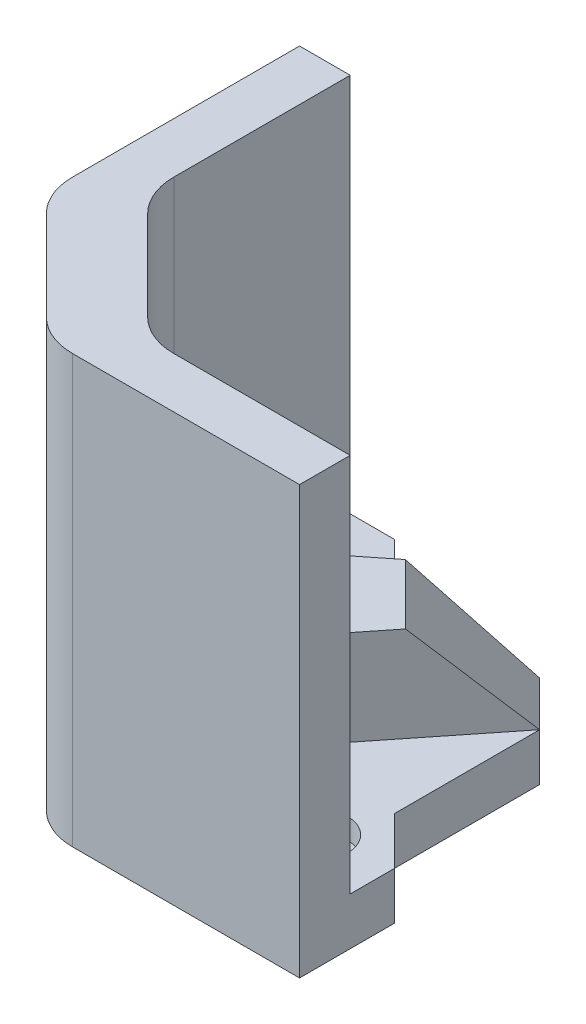
ISO-10303-21;
HEADER;
FILE_DESCRIPTION(('STEP AP214'),'2;1');
FILE_NAME('part.step','',(''),(''),'','','');
FILE_SCHEMA(('AUTOMOTIVE_DESIGN { 1 0 10303 214 1 1 1 1 }'));
ENDSEC;
DATA;
#1=APPLICATION_CONTEXT('core data for automotive mechanical design processes');
#2=APPLICATION_PROTOCOL_DEFINITION('international standard','automotive_design',2000,#1);
#3=PRODUCT_CONTEXT('',#1,'mechanical');
#4=PRODUCT('Part','Part','',(#3));
#5=PRODUCT_RELATED_PRODUCT_CATEGORY('part','',(#4));
#6=PRODUCT_DEFINITION_FORMATION('','',#4);
#7=PRODUCT_DEFINITION_CONTEXT('part definition',#1,'design');
#8=PRODUCT_DEFINITION('design','',#6,#7);
#9=PRODUCT_DEFINITION_SHAPE('','',#8);
#10=(LENGTH_UNIT() NAMED_UNIT(*) SI_UNIT(.MILLI.,.METRE.));
#11=(NAMED_UNIT(*) PLANE_ANGLE_UNIT() SI_UNIT($,.RADIAN.));
#12=(NAMED_UNIT(*) SI_UNIT($,.STERADIAN.) SOLID_ANGLE_UNIT());
#13=UNCERTAINTY_MEASURE_WITH_UNIT(LENGTH_MEASURE(1.E-05),#10,'distance_accuracy_value','');
#14=(GEOMETRIC_REPRESENTATION_CONTEXT(3) GLOBAL_UNCERTAINTY_ASSIGNED_CONTEXT((#13)) GLOBAL_UNIT_ASSIGNED_CONTEXT((#10,
#11,#12)) REPRESENTATION_CONTEXT('',''));
#15=CARTESIAN_POINT('',(0.,0.,0.));
#16=DIRECTION('',(0.,0.,1.));
#17=DIRECTION('',(1.,0.,0.));
#18=AXIS2_PLACEMENT_3D('',#15,#16,#17);
#19=CARTESIAN_POINT('',(0.,7.5,0.));
#20=DIRECTION('',(0.,-1.,0.));
#21=DIRECTION('',(0.,0.,-1.));
#22=AXIS2_PLACEMENT_3D('',#19,#20,#21);
#23=PLANE('',#22);
#24=CARTESIAN_POINT('',(13.4,7.5,-36.5999999999999));
#25=DIRECTION('',(0.,1.,0.));
#26=DIRECTION('',(0.,0.,1.));
#27=AXIS2_PLACEMENT_3D('',#24,#25,#26);
#28=CIRCLE('',#27,5.);
#29=CARTESIAN_POINT('',(13.4,7.5,-31.5999999999999));
#30=VERTEX_POINT('',#29);
#31=EDGE_CURVE('E243',#30,#30,#28,.T.);
#32=ORIENTED_EDGE('',*,*,#31,.F.);
#33=EDGE_LOOP('',(#32));
#34=FACE_BOUND('',#33,.T.);
#35=CARTESIAN_POINT('',(13.4,7.5,-49.1879059907883));
#36=DIRECTION('',(0.,1.,0.));
#37=DIRECTION('',(0.,0.,1.));
#38=AXIS2_PLACEMENT_3D('',#35,#36,#37);
#39=CIRCLE('',#38,5.);
#40=CARTESIAN_POINT('',(13.4,7.5,-44.1879059907883));
#41=VERTEX_POINT('',#40);
#42=EDGE_CURVE('E518',#41,#41,#39,.T.);
#43=ORIENTED_EDGE('',*,*,#42,.F.);
#44=EDGE_LOOP('',(#43));
#45=FACE_BOUND('',#44,.T.);
#46=DIRECTION('',(-0.782758539270881,0.,0.622325533140427));
#47=VECTOR('',#46,1.);
#48=CARTESIAN_POINT('',(45.4289321881342,7.5,-52.5000000000003));
#49=LINE('',#48,#47);
#50=CARTESIAN_POINT('',(45.4289321881342,7.5,-52.5000000000003));
#51=VERTEX_POINT('',#50);
#52=CARTESIAN_POINT('',(10.9289321881345,7.5,-25.0710678118656));
#53=VERTEX_POINT('',#52);
#54=EDGE_CURVE('E210',#51,#53,#49,.T.);
#55=ORIENTED_EDGE('',*,*,#54,.F.);
#56=DIRECTION('',(-1.,0.,0.));
#57=VECTOR('',#56,1.);
#58=CARTESIAN_POINT('',(22.4999999999997,7.5,-52.5000000000003));
#59=LINE('',#58,#57);
#60=CARTESIAN_POINT('',(22.4999999999997,7.5,-52.5000000000003));
#61=VERTEX_POINT('',#60);
#62=EDGE_CURVE('E267',#51,#61,#59,.T.);
#63=ORIENTED_EDGE('',*,*,#62,.T.);
#64=DIRECTION('',(-0.707106781186547,0.,-0.707106781186547));
#65=VECTOR('',#64,1.);
#66=CARTESIAN_POINT('',(15.,7.5,-60.));
#67=LINE('',#66,#65);
#68=CARTESIAN_POINT('',(15.,7.5,-60.));
#69=VERTEX_POINT('',#68);
#70=EDGE_CURVE('E417',#61,#69,#67,.T.);
#71=ORIENTED_EDGE('',*,*,#70,.T.);
#72=DIRECTION('',(-1.,0.,0.));
#73=VECTOR('',#72,1.);
#74=CARTESIAN_POINT('',(0.,7.5,-60.));
#75=LINE('',#74,#73);
#76=CARTESIAN_POINT('',(8.,7.5,-60.));
#77=VERTEX_POINT('',#76);
#78=EDGE_CURVE('E397',#69,#77,#75,.T.);
#79=ORIENTED_EDGE('',*,*,#78,.T.);
#80=DIRECTION('',(0.,0.,-1.));
#81=VECTOR('',#80,1.);
#82=CARTESIAN_POINT('',(8.,7.5,-7.99999999999999));
#83=LINE('',#82,#81);
#84=CARTESIAN_POINT('',(8.,7.5,-32.1421356237311));
#85=VERTEX_POINT('',#84);
#86=EDGE_CURVE('E395',#85,#77,#83,.T.);
#87=ORIENTED_EDGE('',*,*,#86,.F.);
#88=CARTESIAN_POINT('',(18.,7.5,-32.1421356237311));
#89=DIRECTION('',(0.,-1.,0.));
#90=DIRECTION('',(0.,0.,-1.));
#91=AXIS2_PLACEMENT_3D('',#88,#89,#90);
#92=CIRCLE('',#91,10.);
#93=EDGE_CURVE('E211',#85,#53,#92,.F.);
#94=ORIENTED_EDGE('',*,*,#93,.T.);
#95=EDGE_LOOP('',(#55,#63,#71,#79,#87,#94));
#96=FACE_BOUND('',#95,.T.);
#97=ADVANCED_FACE('F39',(#34,#45,#96),#23,.F.);
#98=CARTESIAN_POINT('',(49.1879059907883,7.5,-13.4));
#99=DIRECTION('',(0.,1.,0.));
#100=DIRECTION('',(0.,0.,1.));
#101=AXIS2_PLACEMENT_3D('',#98,#99,#100);
#102=CIRCLE('',#101,5.);
#103=CARTESIAN_POINT('',(49.1879059907883,7.5,-8.4));
#104=VERTEX_POINT('',#103);
#105=EDGE_CURVE('E233',#104,#104,#102,.T.);
#106=ORIENTED_EDGE('',*,*,#105,.F.);
#107=EDGE_LOOP('',(#106));
#108=FACE_BOUND('',#107,.T.);
#109=CARTESIAN_POINT('',(36.5999999999999,7.5,-13.4));
#110=DIRECTION('',(0.,1.,0.));
#111=DIRECTION('',(0.,0.,1.));
#112=AXIS2_PLACEMENT_3D('',#109,#110,#111);
#113=CIRCLE('',#112,5.);
#114=CARTESIAN_POINT('',(36.5999999999999,7.5,-8.4));
#115=VERTEX_POINT('',#114);
#116=EDGE_CURVE('E238',#115,#115,#113,.T.);
#117=ORIENTED_EDGE('',*,*,#116,.F.);
#118=EDGE_LOOP('',(#117));
#119=FACE_BOUND('',#118,.T.);
#120=DIRECTION('',(0.622325533140426,0.,-0.782758539270882));
#121=VECTOR('',#120,1.);
#122=CARTESIAN_POINT('',(52.5000000000002,7.5,-45.4289321881342));
#123=LINE('',#122,#121);
#124=CARTESIAN_POINT('',(25.0710678118654,7.5,-10.9289321881346));
#125=VERTEX_POINT('',#124);
#126=CARTESIAN_POINT('',(52.4999999999997,7.5,-45.4289321881348));
#127=VERTEX_POINT('',#126);
#128=EDGE_CURVE('E186',#125,#127,#123,.T.);
#129=ORIENTED_EDGE('',*,*,#128,.F.);
#130=CARTESIAN_POINT('',(32.1421356237309,7.5,-18.));
#131=DIRECTION('',(0.,-1.,0.));
#132=DIRECTION('',(0.,0.,-1.));
#133=AXIS2_PLACEMENT_3D('',#130,#131,#132);
#134=CIRCLE('',#133,10.);
#135=CARTESIAN_POINT('',(32.1421356237309,7.5,-7.99999999999999));
#136=VERTEX_POINT('',#135);
#137=EDGE_CURVE('E217',#125,#136,#134,.F.);
#138=ORIENTED_EDGE('',*,*,#137,.T.);
#139=DIRECTION('',(-1.,0.,0.));
#140=VECTOR('',#139,1.);
#141=CARTESIAN_POINT('',(60.,7.5,-8.));
#142=LINE('',#141,#140);
#143=CARTESIAN_POINT('',(60.,7.5,-8.));
#144=VERTEX_POINT('',#143);
#145=EDGE_CURVE('E399',#144,#136,#142,.T.);
#146=ORIENTED_EDGE('',*,*,#145,.F.);
#147=DIRECTION('',(0.,0.,-1.));
#148=VECTOR('',#147,1.);
#149=CARTESIAN_POINT('',(60.,7.5,-15.));
#150=LINE('',#149,#148);
#151=CARTESIAN_POINT('',(60.,7.5,-15.));
#152=VERTEX_POINT('',#151);
#153=EDGE_CURVE('E412',#144,#152,#150,.T.);
#154=ORIENTED_EDGE('',*,*,#153,.T.);
#155=DIRECTION('',(-0.707106781186548,0.,-0.707106781186548));
#156=VECTOR('',#155,1.);
#157=CARTESIAN_POINT('',(52.4999999999997,7.5,-22.5000000000003));
#158=LINE('',#157,#156);
#159=CARTESIAN_POINT('',(52.4999999999997,7.5,-22.5000000000003));
#160=VERTEX_POINT('',#159);
#161=EDGE_CURVE('E263',#152,#160,#158,.T.);
#162=ORIENTED_EDGE('',*,*,#161,.T.);
#163=DIRECTION('',(0.,0.,-1.));
#164=VECTOR('',#163,1.);
#165=CARTESIAN_POINT('',(52.4999999999997,7.5,-45.4289321881348));
#166=LINE('',#165,#164);
#167=EDGE_CURVE('E259',#160,#127,#166,.T.);
#168=ORIENTED_EDGE('',*,*,#167,.T.);
#169=EDGE_LOOP('',(#129,#138,#146,#154,#162,#168));
#170=FACE_BOUND('',#169,.T.);
#171=ADVANCED_FACE('F260',(#108,#119,#170),#23,.F.);
#172=CARTESIAN_POINT('',(8.,67.5,-28.0000000000001));
#173=DIRECTION('',(0.707106781186551,0.,-0.707106781186544));
#174=DIRECTION('',(0.,1.,0.));
#175=AXIS2_PLACEMENT_3D('',#172,#173,#174);
#176=PLANE('',#175);
#177=DIRECTION('',(0.707106781186546,0.,0.707106781186549));
#178=VECTOR('',#177,1.);
#179=CARTESIAN_POINT('',(10.9289321881346,22.5,-25.0710678118654));
#180=LINE('',#179,#178);
#181=CARTESIAN_POINT('',(10.9289321881346,22.5,-25.0710678118654));
#182=VERTEX_POINT('',#181);
#183=CARTESIAN_POINT('',(25.0710678118654,22.5,-10.9289321881346));
#184=VERTEX_POINT('',#183);
#185=EDGE_CURVE('E182',#182,#184,#180,.T.);
#186=ORIENTED_EDGE('',*,*,#185,.F.);
#187=DIRECTION('',(0.,-1.,0.));
#188=VECTOR('',#187,1.);
#189=CARTESIAN_POINT('',(10.9289321881345,67.5,-25.0710678118656));
#190=LINE('',#189,#188);
#191=CARTESIAN_POINT('',(10.9289321881345,67.5,-25.0710678118656));
#192=VERTEX_POINT('',#191);
#193=EDGE_CURVE('E191',#182,#192,#190,.F.);
#194=ORIENTED_EDGE('',*,*,#193,.T.);
#195=DIRECTION('',(0.707106781186544,0.,0.707106781186551));
#196=VECTOR('',#195,1.);
#197=CARTESIAN_POINT('',(8.,67.5,-28.0000000000001));
#198=LINE('',#197,#196);
#199=CARTESIAN_POINT('',(25.0710678118654,67.5,-10.9289321881346));
#200=VERTEX_POINT('',#199);
#201=EDGE_CURVE('E456',#200,#192,#198,.F.);
#202=ORIENTED_EDGE('',*,*,#201,.F.);
#203=DIRECTION('',(0.,1.,0.));
#204=VECTOR('',#203,1.);
#205=CARTESIAN_POINT('',(25.0710678118654,7.5,-10.9289321881346));
#206=LINE('',#205,#204);
#207=EDGE_CURVE('E205',#200,#184,#206,.F.);
#208=ORIENTED_EDGE('',*,*,#207,.T.);
#209=EDGE_LOOP('',(#186,#194,#202,#208));
#210=FACE_BOUND('',#209,.T.);
#211=ADVANCED_FACE('F203',(#210),#176,.T.);
#212=CARTESIAN_POINT('',(60.,7.5,0.));
#213=DIRECTION('',(0.,0.,-1.));
#214=DIRECTION('',(-1.,0.,0.));
#215=AXIS2_PLACEMENT_3D('',#212,#213,#214);
#216=PLANE('',#215);
#217=DIRECTION('',(1.,0.,0.));
#218=VECTOR('',#217,1.);
#219=CARTESIAN_POINT('',(0.,67.5,0.));
#220=LINE('',#219,#218);
#221=CARTESIAN_POINT('',(24.142135623731,67.5,0.));
#222=VERTEX_POINT('',#221);
#223=CARTESIAN_POINT('',(60.,67.5,0.));
#224=VERTEX_POINT('',#223);
#225=EDGE_CURVE('E489',#222,#224,#220,.T.);
#226=ORIENTED_EDGE('',*,*,#225,.F.);
#227=DIRECTION('',(0.,1.,0.));
#228=VECTOR('',#227,1.);
#229=CARTESIAN_POINT('',(24.142135623731,0.,0.));
#230=LINE('',#229,#228);
#231=CARTESIAN_POINT('',(24.142135623731,0.,0.));
#232=VERTEX_POINT('',#231);
#233=EDGE_CURVE('E475',#222,#232,#230,.F.);
#234=ORIENTED_EDGE('',*,*,#233,.T.);
#235=DIRECTION('',(1.,0.,0.));
#236=VECTOR('',#235,1.);
#237=CARTESIAN_POINT('',(60.,0.,0.));
#238=LINE('',#237,#236);
#239=CARTESIAN_POINT('',(60.,0.,0.));
#240=VERTEX_POINT('',#239);
#241=EDGE_CURVE('E411',#232,#240,#238,.T.);
#242=ORIENTED_EDGE('',*,*,#241,.T.);
#243=DIRECTION('',(0.,-1.,0.));
#244=VECTOR('',#243,1.);
#245=CARTESIAN_POINT('',(60.,7.5,0.));
#246=LINE('',#245,#244);
#247=EDGE_CURVE('E450',#224,#240,#246,.T.);
#248=ORIENTED_EDGE('',*,*,#247,.F.);
#249=EDGE_LOOP('',(#226,#234,#242,#248));
#250=FACE_BOUND('',#249,.T.);
#251=ADVANCED_FACE('F327',(#250),#216,.F.);
#252=CARTESIAN_POINT('',(60.,7.5,-15.));
#253=DIRECTION('',(-1.,0.,0.));
#254=DIRECTION('',(0.,0.,1.));
#255=AXIS2_PLACEMENT_3D('',#252,#253,#254);
#256=PLANE('',#255);
#257=DIRECTION('',(0.,0.,-1.));
#258=VECTOR('',#257,1.);
#259=CARTESIAN_POINT('',(60.,0.,-15.));
#260=LINE('',#259,#258);
#261=CARTESIAN_POINT('',(60.,0.,-15.));
#262=VERTEX_POINT('',#261);
#263=EDGE_CURVE('E422',#240,#262,#260,.T.);
#264=ORIENTED_EDGE('',*,*,#263,.T.);
#265=DIRECTION('',(0.,-1.,0.));
#266=VECTOR('',#265,1.);
#267=CARTESIAN_POINT('',(60.,7.5,-15.));
#268=LINE('',#267,#266);
#269=EDGE_CURVE('E447',#152,#262,#268,.T.);
#270=ORIENTED_EDGE('',*,*,#269,.F.);
#271=ORIENTED_EDGE('',*,*,#153,.F.);
#272=DIRECTION('',(0.,-1.,0.));
#273=VECTOR('',#272,1.);
#274=CARTESIAN_POINT('',(60.,67.5,-8.));
#275=LINE('',#274,#273);
#276=CARTESIAN_POINT('',(60.,67.5,-8.));
#277=VERTEX_POINT('',#276);
#278=EDGE_CURVE('E408',#277,#144,#275,.T.);
#279=ORIENTED_EDGE('',*,*,#278,.F.);
#280=DIRECTION('',(0.,0.,-1.));
#281=VECTOR('',#280,1.);
#282=CARTESIAN_POINT('',(60.,67.5,0.));
#283=LINE('',#282,#281);
#284=EDGE_CURVE('E486',#224,#277,#283,.T.);
#285=ORIENTED_EDGE('',*,*,#284,.F.);
#286=ORIENTED_EDGE('',*,*,#247,.T.);
#287=EDGE_LOOP('',(#264,#270,#271,#279,#285,#286));
#288=FACE_BOUND('',#287,.T.);
#289=ADVANCED_FACE('F323',(#288),#256,.F.);
#290=CARTESIAN_POINT('',(52.4999999999997,7.5,-22.5000000000003));
#291=DIRECTION('',(-0.707106781186547,0.,0.707106781186547));
#292=DIRECTION('',(0.707106781186548,0.,0.707106781186548));
#293=AXIS2_PLACEMENT_3D('',#290,#291,#292);
#294=PLANE('',#293);
#295=DIRECTION('',(-0.707106781186548,0.,-0.707106781186548));
#296=VECTOR('',#295,1.);
#297=CARTESIAN_POINT('',(52.4999999999997,0.,-22.5000000000003));
#298=LINE('',#297,#296);
#299=CARTESIAN_POINT('',(52.4999999999997,0.,-22.5000000000003));
#300=VERTEX_POINT('',#299);
#301=EDGE_CURVE('E424',#262,#300,#298,.T.);
#302=ORIENTED_EDGE('',*,*,#301,.T.);
#303=DIRECTION('',(0.,-1.,0.));
#304=VECTOR('',#303,1.);
#305=CARTESIAN_POINT('',(52.4999999999997,7.5,-22.5000000000003));
#306=LINE('',#305,#304);
#307=EDGE_CURVE('E272',#160,#300,#306,.T.);
#308=ORIENTED_EDGE('',*,*,#307,.F.);
#309=ORIENTED_EDGE('',*,*,#161,.F.);
#310=ORIENTED_EDGE('',*,*,#269,.T.);
#311=EDGE_LOOP('',(#302,#308,#309,#310));
#312=FACE_BOUND('',#311,.T.);
#313=ADVANCED_FACE('F320',(#312),#294,.F.);
#314=CARTESIAN_POINT('',(52.4999999999997,7.5,-45.4289321881348));
#315=DIRECTION('',(-1.,0.,0.));
#316=DIRECTION('',(0.,0.,1.));
#317=AXIS2_PLACEMENT_3D('',#314,#315,#316);
#318=PLANE('',#317);
#319=DIRECTION('',(0.,0.,-1.));
#320=VECTOR('',#319,1.);
#321=CARTESIAN_POINT('',(52.4999999999997,0.,-45.4289321881348));
#322=LINE('',#321,#320);
#323=CARTESIAN_POINT('',(52.4999999999997,0.,-45.4289321881348));
#324=VERTEX_POINT('',#323);
#325=EDGE_CURVE('E271',#300,#324,#322,.T.);
#326=ORIENTED_EDGE('',*,*,#325,.T.);
#327=DIRECTION('',(0.,-1.,0.));
#328=VECTOR('',#327,1.);
#329=CARTESIAN_POINT('',(52.4999999999997,7.5,-45.4289321881348));
#330=LINE('',#329,#328);
#331=EDGE_CURVE('E252',#127,#324,#330,.T.);
#332=ORIENTED_EDGE('',*,*,#331,.F.);
#333=ORIENTED_EDGE('',*,*,#167,.F.);
#334=ORIENTED_EDGE('',*,*,#307,.T.);
#335=EDGE_LOOP('',(#326,#332,#333,#334));
#336=FACE_BOUND('',#335,.T.);
#337=ADVANCED_FACE('F269',(#336),#318,.F.);
#338=CARTESIAN_POINT('',(45.4289321881342,7.5,-52.5000000000003));
#339=DIRECTION('',(-0.707106781186543,0.,0.707106781186552));
#340=DIRECTION('',(0.707106781186552,0.,0.707106781186543));
#341=AXIS2_PLACEMENT_3D('',#338,#339,#340);
#342=PLANE('',#341);
#343=DIRECTION('',(0.,-1.,0.));
#344=VECTOR('',#343,1.);
#345=CARTESIAN_POINT('',(45.4289321881342,7.5,-52.5000000000003));
#346=LINE('',#345,#344);
#347=CARTESIAN_POINT('',(45.4289321881342,0.,-52.5000000000003));
#348=VERTEX_POINT('',#347);
#349=EDGE_CURVE('E255',#51,#348,#346,.T.);
#350=ORIENTED_EDGE('',*,*,#349,.F.);
#351=DIRECTION('',(0.707106781186552,0.,0.707106781186543));
#352=VECTOR('',#351,1.);
#353=CARTESIAN_POINT('',(45.4289321881342,7.49999999999995,-52.5000000000003));
#354=LINE('',#353,#352);
#355=EDGE_CURVE('E48',#51,#127,#354,.T.);
#356=ORIENTED_EDGE('',*,*,#355,.T.);
#357=ORIENTED_EDGE('',*,*,#331,.T.);
#358=DIRECTION('',(-0.707106781186552,0.,-0.707106781186543));
#359=VECTOR('',#358,1.);
#360=CARTESIAN_POINT('',(45.4289321881342,0.,-52.5000000000003));
#361=LINE('',#360,#359);
#362=EDGE_CURVE('E427',#324,#348,#361,.T.);
#363=ORIENTED_EDGE('',*,*,#362,.T.);
#364=EDGE_LOOP('',(#350,#356,#357,#363));
#365=FACE_BOUND('',#364,.T.);
#366=ADVANCED_FACE('F250',(#365),#342,.F.);
#367=CARTESIAN_POINT('',(22.4999999999997,7.5,-52.5000000000003));
#368=DIRECTION('',(0.,0.,1.));
#369=DIRECTION('',(1.,0.,0.));
#370=AXIS2_PLACEMENT_3D('',#367,#368,#369);
#371=PLANE('',#370);
#372=DIRECTION('',(-1.,0.,0.));
#373=VECTOR('',#372,1.);
#374=CARTESIAN_POINT('',(22.4999999999997,0.,-52.5000000000003));
#375=LINE('',#374,#373);
#376=CARTESIAN_POINT('',(22.4999999999997,0.,-52.5000000000003));
#377=VERTEX_POINT('',#376);
#378=EDGE_CURVE('E429',#348,#377,#375,.T.);
#379=ORIENTED_EDGE('',*,*,#378,.T.);
#380=DIRECTION('',(0.,-1.,0.));
#381=VECTOR('',#380,1.);
#382=CARTESIAN_POINT('',(22.4999999999997,7.5,-52.5000000000003));
#383=LINE('',#382,#381);
#384=EDGE_CURVE('E442',#61,#377,#383,.T.);
#385=ORIENTED_EDGE('',*,*,#384,.F.);
#386=ORIENTED_EDGE('',*,*,#62,.F.);
#387=ORIENTED_EDGE('',*,*,#349,.T.);
#388=EDGE_LOOP('',(#379,#385,#386,#387));
#389=FACE_BOUND('',#388,.T.);
#390=ADVANCED_FACE('F311',(#389),#371,.F.);
#391=CARTESIAN_POINT('',(15.,7.5,-60.));
#392=DIRECTION('',(-0.707106781186547,0.,0.707106781186547));
#393=DIRECTION('',(0.707106781186548,0.,0.707106781186548));
#394=AXIS2_PLACEMENT_3D('',#391,#392,#393);
#395=PLANE('',#394);
#396=DIRECTION('',(-0.707106781186547,0.,-0.707106781186547));
#397=VECTOR('',#396,1.);
#398=CARTESIAN_POINT('',(15.,0.,-60.));
#399=LINE('',#398,#397);
#400=CARTESIAN_POINT('',(15.,0.,-60.));
#401=VERTEX_POINT('',#400);
#402=EDGE_CURVE('E431',#377,#401,#399,.T.);
#403=ORIENTED_EDGE('',*,*,#402,.T.);
#404=DIRECTION('',(0.,-1.,0.));
#405=VECTOR('',#404,1.);
#406=CARTESIAN_POINT('',(15.,7.5,-60.));
#407=LINE('',#406,#405);
#408=EDGE_CURVE('E439',#69,#401,#407,.T.);
#409=ORIENTED_EDGE('',*,*,#408,.F.);
#410=ORIENTED_EDGE('',*,*,#70,.F.);
#411=ORIENTED_EDGE('',*,*,#384,.T.);
#412=EDGE_LOOP('',(#403,#409,#410,#411));
#413=FACE_BOUND('',#412,.T.);
#414=ADVANCED_FACE('F307',(#413),#395,.F.);
#415=CARTESIAN_POINT('',(0.,7.5,-60.));
#416=DIRECTION('',(0.,0.,1.));
#417=DIRECTION('',(1.,0.,0.));
#418=AXIS2_PLACEMENT_3D('',#415,#416,#417);
#419=PLANE('',#418);
#420=DIRECTION('',(-1.,0.,0.));
#421=VECTOR('',#420,1.);
#422=CARTESIAN_POINT('',(0.,0.,-60.));
#423=LINE('',#422,#421);
#424=CARTESIAN_POINT('',(0.,0.,-60.));
#425=VERTEX_POINT('',#424);
#426=EDGE_CURVE('E433',#401,#425,#423,.T.);
#427=ORIENTED_EDGE('',*,*,#426,.T.);
#428=DIRECTION('',(0.,-1.,0.));
#429=VECTOR('',#428,1.);
#430=CARTESIAN_POINT('',(0.,7.5,-60.));
#431=LINE('',#430,#429);
#432=CARTESIAN_POINT('',(0.,67.5,-60.));
#433=VERTEX_POINT('',#432);
#434=EDGE_CURVE('E420',#433,#425,#431,.T.);
#435=ORIENTED_EDGE('',*,*,#434,.F.);
#436=DIRECTION('',(-1.,0.,0.));
#437=VECTOR('',#436,1.);
#438=CARTESIAN_POINT('',(8.,67.5,-60.));
#439=LINE('',#438,#437);
#440=CARTESIAN_POINT('',(8.,67.5,-60.));
#441=VERTEX_POINT('',#440);
#442=EDGE_CURVE('E398',#441,#433,#439,.T.);
#443=ORIENTED_EDGE('',*,*,#442,.F.);
#444=DIRECTION('',(0.,-1.,0.));
#445=VECTOR('',#444,1.);
#446=CARTESIAN_POINT('',(8.,67.5,-60.));
#447=LINE('',#446,#445);
#448=EDGE_CURVE('E388',#441,#77,#447,.T.);
#449=ORIENTED_EDGE('',*,*,#448,.T.);
#450=ORIENTED_EDGE('',*,*,#78,.F.);
#451=ORIENTED_EDGE('',*,*,#408,.T.);
#452=EDGE_LOOP('',(#427,#435,#443,#449,#450,#451));
#453=FACE_BOUND('',#452,.T.);
#454=ADVANCED_FACE('F303',(#453),#419,.F.);
#455=CARTESIAN_POINT('',(0.,7.5,0.));
#456=DIRECTION('',(1.,0.,0.));
#457=DIRECTION('',(0.,0.,-1.));
#458=AXIS2_PLACEMENT_3D('',#455,#456,#457);
#459=PLANE('',#458);
#460=DIRECTION('',(0.,0.,1.));
#461=VECTOR('',#460,1.);
#462=CARTESIAN_POINT('',(0.,0.,0.));
#463=LINE('',#462,#461);
#464=CARTESIAN_POINT('',(0.,0.,-24.142135623731));
#465=VERTEX_POINT('',#464);
#466=EDGE_CURVE('E414',#425,#465,#463,.T.);
#467=ORIENTED_EDGE('',*,*,#466,.T.);
#468=DIRECTION('',(0.,-1.,0.));
#469=VECTOR('',#468,1.);
#470=CARTESIAN_POINT('',(0.,67.5,-24.142135623731));
#471=LINE('',#470,#469);
#472=CARTESIAN_POINT('',(0.,67.5,-24.142135623731));
#473=VERTEX_POINT('',#472);
#474=EDGE_CURVE('E461',#465,#473,#471,.F.);
#475=ORIENTED_EDGE('',*,*,#474,.T.);
#476=DIRECTION('',(0.,0.,1.));
#477=VECTOR('',#476,1.);
#478=CARTESIAN_POINT('',(0.,67.5,-60.));
#479=LINE('',#478,#477);
#480=EDGE_CURVE('E401',#433,#473,#479,.T.);
#481=ORIENTED_EDGE('',*,*,#480,.F.);
#482=ORIENTED_EDGE('',*,*,#434,.T.);
#483=EDGE_LOOP('',(#467,#475,#481,#482));
#484=FACE_BOUND('',#483,.T.);
#485=ADVANCED_FACE('F299',(#484),#459,.F.);
#486=CARTESIAN_POINT('',(0.,0.,0.));
#487=DIRECTION('',(0.,-1.,0.));
#488=DIRECTION('',(0.,0.,-1.));
#489=AXIS2_PLACEMENT_3D('',#486,#487,#488);
#490=PLANE('',#489);
#491=CARTESIAN_POINT('',(49.1879059907883,0.,-13.4));
#492=DIRECTION('',(0.,1.,0.));
#493=DIRECTION('',(0.,0.,1.));
#494=AXIS2_PLACEMENT_3D('',#491,#492,#493);
#495=CIRCLE('',#494,2.7);
#496=CARTESIAN_POINT('',(49.1879059907883,0.,-10.7));
#497=VERTEX_POINT('',#496);
#498=EDGE_CURVE('E496',#497,#497,#495,.T.);
#499=ORIENTED_EDGE('',*,*,#498,.T.);
#500=EDGE_LOOP('',(#499));
#501=FACE_BOUND('',#500,.T.);
#502=CARTESIAN_POINT('',(13.4,0.,-49.1879059907883));
#503=DIRECTION('',(0.,1.,0.));
#504=DIRECTION('',(0.,0.,-1.));
#505=AXIS2_PLACEMENT_3D('',#502,#503,#504);
#506=CIRCLE('',#505,2.69999999999999);
#507=CARTESIAN_POINT('',(13.4,0.,-51.8879059907883));
#508=VERTEX_POINT('',#507);
#509=EDGE_CURVE('E497',#508,#508,#506,.T.);
#510=ORIENTED_EDGE('',*,*,#509,.T.);
#511=EDGE_LOOP('',(#510));
#512=FACE_BOUND('',#511,.T.);
#513=CARTESIAN_POINT('',(13.4,0.,-36.5999999999999));
#514=DIRECTION('',(0.,1.,0.));
#515=DIRECTION('',(0.,0.,-1.));
#516=AXIS2_PLACEMENT_3D('',#513,#514,#515);
#517=CIRCLE('',#516,2.7);
#518=CARTESIAN_POINT('',(13.4,0.,-39.2999999999999));
#519=VERTEX_POINT('',#518);
#520=EDGE_CURVE('E228',#519,#519,#517,.T.);
#521=ORIENTED_EDGE('',*,*,#520,.T.);
#522=EDGE_LOOP('',(#521));
#523=FACE_BOUND('',#522,.T.);
#524=CARTESIAN_POINT('',(36.5999999999999,0.,-13.4));
#525=DIRECTION('',(0.,1.,0.));
#526=DIRECTION('',(0.,0.,1.));
#527=AXIS2_PLACEMENT_3D('',#524,#525,#526);
#528=CIRCLE('',#527,2.69999999999998);
#529=CARTESIAN_POINT('',(36.5999999999999,0.,-10.7));
#530=VERTEX_POINT('',#529);
#531=EDGE_CURVE('E404',#530,#530,#528,.T.);
#532=ORIENTED_EDGE('',*,*,#531,.T.);
#533=EDGE_LOOP('',(#532));
#534=FACE_BOUND('',#533,.T.);
#535=DIRECTION('',(0.707106781186546,0.,0.707106781186549));
#536=VECTOR('',#535,1.);
#537=CARTESIAN_POINT('',(10.,0.,-10.));
#538=LINE('',#537,#536);
#539=CARTESIAN_POINT('',(17.0710678118655,0.,-2.92893218813454));
#540=VERTEX_POINT('',#539);
#541=CARTESIAN_POINT('',(2.92893218813452,0.,-17.0710678118656));
#542=VERTEX_POINT('',#541);
#543=EDGE_CURVE('E453',#540,#542,#538,.F.);
#544=ORIENTED_EDGE('',*,*,#543,.T.);
#545=CARTESIAN_POINT('',(10.,0.,-24.142135623731));
#546=DIRECTION('',(0.,-1.,0.));
#547=DIRECTION('',(0.,0.,-1.));
#548=AXIS2_PLACEMENT_3D('',#545,#546,#547);
#549=CIRCLE('',#548,10.);
#550=EDGE_CURVE('E474',#542,#465,#549,.T.);
#551=ORIENTED_EDGE('',*,*,#550,.T.);
#552=ORIENTED_EDGE('',*,*,#466,.F.);
#553=ORIENTED_EDGE('',*,*,#426,.F.);
#554=ORIENTED_EDGE('',*,*,#402,.F.);
#555=ORIENTED_EDGE('',*,*,#378,.F.);
#556=ORIENTED_EDGE('',*,*,#362,.F.);
#557=ORIENTED_EDGE('',*,*,#325,.F.);
#558=ORIENTED_EDGE('',*,*,#301,.F.);
#559=ORIENTED_EDGE('',*,*,#263,.F.);
#560=ORIENTED_EDGE('',*,*,#241,.F.);
#561=CARTESIAN_POINT('',(24.142135623731,0.,-10.));
#562=DIRECTION('',(0.,-1.,0.));
#563=DIRECTION('',(0.,0.,-1.));
#564=AXIS2_PLACEMENT_3D('',#561,#562,#563);
#565=CIRCLE('',#564,10.);
#566=EDGE_CURVE('E472',#232,#540,#565,.T.);
#567=ORIENTED_EDGE('',*,*,#566,.T.);
#568=EDGE_LOOP('',(#544,#551,#552,#553,#554,#555,#556,#557,#558,#559,#560,#567));
#569=FACE_BOUND('',#568,.T.);
#570=ADVANCED_FACE('F296',(#501,#512,#523,#534,#569),#490,.T.);
#571=CARTESIAN_POINT('',(60.,67.5,-8.));
#572=DIRECTION('',(0.,0.,1.));
#573=DIRECTION('',(1.,0.,0.));
#574=AXIS2_PLACEMENT_3D('',#571,#572,#573);
#575=PLANE('',#574);
#576=ORIENTED_EDGE('',*,*,#145,.T.);
#577=DIRECTION('',(0.,-1.,0.));
#578=VECTOR('',#577,1.);
#579=CARTESIAN_POINT('',(32.1421356237309,67.5,-7.99999999999999));
#580=LINE('',#579,#578);
#581=CARTESIAN_POINT('',(32.1421356237309,67.5,-7.99999999999999));
#582=VERTEX_POINT('',#581);
#583=EDGE_CURVE('E200',#136,#582,#580,.F.);
#584=ORIENTED_EDGE('',*,*,#583,.T.);
#585=DIRECTION('',(-1.,0.,0.));
#586=VECTOR('',#585,1.);
#587=CARTESIAN_POINT('',(60.,67.5,-8.));
#588=LINE('',#587,#586);
#589=EDGE_CURVE('E391',#277,#582,#588,.T.);
#590=ORIENTED_EDGE('',*,*,#589,.F.);
#591=ORIENTED_EDGE('',*,*,#278,.T.);
#592=EDGE_LOOP('',(#576,#584,#590,#591));
#593=FACE_BOUND('',#592,.T.);
#594=ADVANCED_FACE('F294',(#593),#575,.F.);
#595=CARTESIAN_POINT('',(8.,67.5,-7.99999999999999));
#596=DIRECTION('',(-1.,0.,0.));
#597=DIRECTION('',(0.,0.,1.));
#598=AXIS2_PLACEMENT_3D('',#595,#596,#597);
#599=PLANE('',#598);
#600=DIRECTION('',(0.,0.,-1.));
#601=VECTOR('',#600,1.);
#602=CARTESIAN_POINT('',(8.,67.5,-7.99999999999999));
#603=LINE('',#602,#601);
#604=CARTESIAN_POINT('',(8.,67.5,-32.1421356237311));
#605=VERTEX_POINT('',#604);
#606=EDGE_CURVE('E385',#605,#441,#603,.T.);
#607=ORIENTED_EDGE('',*,*,#606,.F.);
#608=DIRECTION('',(0.,1.,0.));
#609=VECTOR('',#608,1.);
#610=CARTESIAN_POINT('',(8.,7.5,-32.1421356237311));
#611=LINE('',#610,#609);
#612=EDGE_CURVE('E219',#605,#85,#611,.F.);
#613=ORIENTED_EDGE('',*,*,#612,.T.);
#614=ORIENTED_EDGE('',*,*,#86,.T.);
#615=ORIENTED_EDGE('',*,*,#448,.F.);
#616=EDGE_LOOP('',(#607,#613,#614,#615));
#617=FACE_BOUND('',#616,.T.);
#618=ADVANCED_FACE('F375',(#617),#599,.F.);
#619=CARTESIAN_POINT('',(0.,67.5,0.));
#620=DIRECTION('',(0.,1.,0.));
#621=DIRECTION('',(0.,0.,1.));
#622=AXIS2_PLACEMENT_3D('',#619,#620,#621);
#623=PLANE('',#622);
#624=ORIENTED_EDGE('',*,*,#480,.T.);
#625=CARTESIAN_POINT('',(10.,67.5,-24.142135623731));
#626=DIRECTION('',(0.,1.,0.));
#627=DIRECTION('',(0.,0.,1.));
#628=AXIS2_PLACEMENT_3D('',#625,#626,#627);
#629=CIRCLE('',#628,10.);
#630=CARTESIAN_POINT('',(2.92893218813452,67.5,-17.0710678118656));
#631=VERTEX_POINT('',#630);
#632=EDGE_CURVE('E466',#473,#631,#629,.T.);
#633=ORIENTED_EDGE('',*,*,#632,.T.);
#634=DIRECTION('',(-0.707106781186546,0.,-0.707106781186549));
#635=VECTOR('',#634,1.);
#636=CARTESIAN_POINT('',(10.,67.5,-10.));
#637=LINE('',#636,#635);
#638=CARTESIAN_POINT('',(17.0710678118655,67.5,-2.92893218813454));
#639=VERTEX_POINT('',#638);
#640=EDGE_CURVE('E458',#631,#639,#637,.F.);
#641=ORIENTED_EDGE('',*,*,#640,.T.);
#642=CARTESIAN_POINT('',(24.142135623731,67.5,-10.));
#643=DIRECTION('',(0.,1.,0.));
#644=DIRECTION('',(0.,0.,1.));
#645=AXIS2_PLACEMENT_3D('',#642,#643,#644);
#646=CIRCLE('',#645,10.);
#647=EDGE_CURVE('E464',#639,#222,#646,.T.);
#648=ORIENTED_EDGE('',*,*,#647,.T.);
#649=ORIENTED_EDGE('',*,*,#225,.T.);
#650=ORIENTED_EDGE('',*,*,#284,.T.);
#651=ORIENTED_EDGE('',*,*,#589,.T.);
#652=CARTESIAN_POINT('',(32.1421356237309,67.5,-18.));
#653=DIRECTION('',(0.,1.,0.));
#654=DIRECTION('',(0.,0.,1.));
#655=AXIS2_PLACEMENT_3D('',#652,#653,#654);
#656=CIRCLE('',#655,10.);
#657=EDGE_CURVE('E222',#582,#200,#656,.F.);
#658=ORIENTED_EDGE('',*,*,#657,.T.);
#659=ORIENTED_EDGE('',*,*,#201,.T.);
#660=CARTESIAN_POINT('',(18.,67.5,-32.1421356237311));
#661=DIRECTION('',(0.,1.,0.));
#662=DIRECTION('',(0.,0.,1.));
#663=AXIS2_PLACEMENT_3D('',#660,#661,#662);
#664=CIRCLE('',#663,10.);
#665=EDGE_CURVE('E196',#192,#605,#664,.F.);
#666=ORIENTED_EDGE('',*,*,#665,.T.);
#667=ORIENTED_EDGE('',*,*,#606,.T.);
#668=ORIENTED_EDGE('',*,*,#442,.T.);
#669=EDGE_LOOP('',(#624,#633,#641,#648,#649,#650,#651,#658,#659,#666,#667,#668));
#670=FACE_BOUND('',#669,.T.);
#671=ADVANCED_FACE('F340',(#670),#623,.T.);
#672=CARTESIAN_POINT('',(20.,7.5,0.));
#673=DIRECTION('',(0.707106781186549,0.,-0.707106781186546));
#674=DIRECTION('',(0.,-1.,0.));
#675=AXIS2_PLACEMENT_3D('',#672,#673,#674);
#676=PLANE('',#675);
#677=ORIENTED_EDGE('',*,*,#640,.F.);
#678=DIRECTION('',(0.,1.,0.));
#679=VECTOR('',#678,1.);
#680=CARTESIAN_POINT('',(2.92893218813452,0.,-17.0710678118656));
#681=LINE('',#680,#679);
#682=EDGE_CURVE('E470',#631,#542,#681,.F.);
#683=ORIENTED_EDGE('',*,*,#682,.T.);
#684=ORIENTED_EDGE('',*,*,#543,.F.);
#685=DIRECTION('',(0.,-1.,0.));
#686=VECTOR('',#685,1.);
#687=CARTESIAN_POINT('',(17.0710678118655,67.5,-2.92893218813454));
#688=LINE('',#687,#686);
#689=EDGE_CURVE('E468',#540,#639,#688,.F.);
#690=ORIENTED_EDGE('',*,*,#689,.T.);
#691=EDGE_LOOP('',(#677,#683,#684,#690));
#692=FACE_BOUND('',#691,.T.);
#693=ADVANCED_FACE('F333',(#692),#676,.F.);
#694=CARTESIAN_POINT('',(10.,7.5,-24.142135623731));
#695=DIRECTION('',(0.,1.,0.));
#696=DIRECTION('',(0.,0.,1.));
#697=AXIS2_PLACEMENT_3D('',#694,#695,#696);
#698=CYLINDRICAL_SURFACE('',#697,10.);
#699=ORIENTED_EDGE('',*,*,#550,.F.);
#700=ORIENTED_EDGE('',*,*,#682,.F.);
#701=ORIENTED_EDGE('',*,*,#632,.F.);
#702=ORIENTED_EDGE('',*,*,#474,.F.);
#703=EDGE_LOOP('',(#699,#700,#701,#702));
#704=FACE_BOUND('',#703,.T.);
#705=ADVANCED_FACE('F339',(#704),#698,.T.);
#706=CARTESIAN_POINT('',(24.142135623731,7.5,-10.));
#707=DIRECTION('',(0.,-1.,0.));
#708=DIRECTION('',(0.,0.,-1.));
#709=AXIS2_PLACEMENT_3D('',#706,#707,#708);
#710=CYLINDRICAL_SURFACE('',#709,10.);
#711=ORIENTED_EDGE('',*,*,#647,.F.);
#712=ORIENTED_EDGE('',*,*,#689,.F.);
#713=ORIENTED_EDGE('',*,*,#566,.F.);
#714=ORIENTED_EDGE('',*,*,#233,.F.);
#715=EDGE_LOOP('',(#711,#712,#713,#714));
#716=FACE_BOUND('',#715,.T.);
#717=ADVANCED_FACE('F348',(#716),#710,.T.);
#718=CARTESIAN_POINT('',(32.1421356237309,67.5,-18.));
#719=DIRECTION('',(0.,1.,0.));
#720=DIRECTION('',(0.,0.,1.));
#721=AXIS2_PLACEMENT_3D('',#718,#719,#720);
#722=CYLINDRICAL_SURFACE('',#721,10.);
#723=ORIENTED_EDGE('',*,*,#137,.F.);
#724=DIRECTION('',(0.,-1.,0.));
#725=VECTOR('',#724,1.);
#726=CARTESIAN_POINT('',(25.0710678118654,22.5,-10.9289321881346));
#727=LINE('',#726,#725);
#728=EDGE_CURVE('E276',#184,#125,#727,.T.);
#729=ORIENTED_EDGE('',*,*,#728,.F.);
#730=ORIENTED_EDGE('',*,*,#207,.F.);
#731=ORIENTED_EDGE('',*,*,#657,.F.);
#732=ORIENTED_EDGE('',*,*,#583,.F.);
#733=EDGE_LOOP('',(#723,#729,#730,#731,#732));
#734=FACE_BOUND('',#733,.T.);
#735=ADVANCED_FACE('F352',(#734),#722,.F.);
#736=CARTESIAN_POINT('',(18.,67.5,-32.1421356237311));
#737=DIRECTION('',(0.,-1.,0.));
#738=DIRECTION('',(0.,0.,-1.));
#739=AXIS2_PLACEMENT_3D('',#736,#737,#738);
#740=CYLINDRICAL_SURFACE('',#739,10.);
#741=ORIENTED_EDGE('',*,*,#665,.F.);
#742=ORIENTED_EDGE('',*,*,#193,.F.);
#743=EDGE_CURVE('E193',#53,#182,#190,.F.);
#744=ORIENTED_EDGE('',*,*,#743,.F.);
#745=ORIENTED_EDGE('',*,*,#93,.F.);
#746=ORIENTED_EDGE('',*,*,#612,.F.);
#747=EDGE_LOOP('',(#741,#742,#744,#745,#746));
#748=FACE_BOUND('',#747,.T.);
#749=ADVANCED_FACE('F192',(#748),#740,.F.);
#750=CARTESIAN_POINT('',(36.5999999999999,0.,-13.4));
#751=DIRECTION('',(0.,1.,0.));
#752=DIRECTION('',(0.,0.,1.));
#753=AXIS2_PLACEMENT_3D('',#750,#751,#752);
#754=CYLINDRICAL_SURFACE('',#753,2.69999999999998);
#755=CARTESIAN_POINT('',(36.5999999999999,4.2,-13.4));
#756=DIRECTION('',(0.,-1.,0.));
#757=DIRECTION('',(0.,0.,-1.));
#758=AXIS2_PLACEMENT_3D('',#755,#756,#757);
#759=CIRCLE('',#758,2.69999999999998);
#760=CARTESIAN_POINT('',(36.5999999999999,4.2,-16.1));
#761=VERTEX_POINT('',#760);
#762=EDGE_CURVE('E230',#761,#761,#759,.F.);
#763=ORIENTED_EDGE('',*,*,#762,.T.);
#764=EDGE_LOOP('',(#763));
#765=FACE_BOUND('',#764,.T.);
#766=ORIENTED_EDGE('',*,*,#531,.F.);
#767=EDGE_LOOP('',(#766));
#768=FACE_BOUND('',#767,.T.);
#769=ADVANCED_FACE('F357',(#765,#768),#754,.F.);
#770=CARTESIAN_POINT('',(13.4,0.,-36.5999999999999));
#771=DIRECTION('',(0.,1.,0.));
#772=DIRECTION('',(0.,0.,1.));
#773=AXIS2_PLACEMENT_3D('',#770,#771,#772);
#774=CYLINDRICAL_SURFACE('',#773,2.7);
#775=CARTESIAN_POINT('',(13.4,4.2,-36.5999999999999));
#776=DIRECTION('',(0.,-1.,0.));
#777=DIRECTION('',(0.,0.,-1.));
#778=AXIS2_PLACEMENT_3D('',#775,#776,#777);
#779=CIRCLE('',#778,2.7);
#780=CARTESIAN_POINT('',(13.4,4.2,-39.2999999999999));
#781=VERTEX_POINT('',#780);
#782=EDGE_CURVE('E235',#781,#781,#779,.F.);
#783=ORIENTED_EDGE('',*,*,#782,.T.);
#784=EDGE_LOOP('',(#783));
#785=FACE_BOUND('',#784,.T.);
#786=ORIENTED_EDGE('',*,*,#520,.F.);
#787=EDGE_LOOP('',(#786));
#788=FACE_BOUND('',#787,.T.);
#789=ADVANCED_FACE('F361',(#785,#788),#774,.F.);
#790=CARTESIAN_POINT('',(13.4,0.,-49.1879059907883));
#791=DIRECTION('',(0.,1.,0.));
#792=DIRECTION('',(0.,0.,1.));
#793=AXIS2_PLACEMENT_3D('',#790,#791,#792);
#794=CYLINDRICAL_SURFACE('',#793,2.69999999999999);
#795=CARTESIAN_POINT('',(13.4,4.2,-49.1879059907883));
#796=DIRECTION('',(0.,-1.,0.));
#797=DIRECTION('',(0.,0.,-1.));
#798=AXIS2_PLACEMENT_3D('',#795,#796,#797);
#799=CIRCLE('',#798,2.69999999999999);
#800=CARTESIAN_POINT('',(13.4,4.2,-51.8879059907883));
#801=VERTEX_POINT('',#800);
#802=EDGE_CURVE('E240',#801,#801,#799,.F.);
#803=ORIENTED_EDGE('',*,*,#802,.T.);
#804=EDGE_LOOP('',(#803));
#805=FACE_BOUND('',#804,.T.);
#806=ORIENTED_EDGE('',*,*,#509,.F.);
#807=EDGE_LOOP('',(#806));
#808=FACE_BOUND('',#807,.T.);
#809=ADVANCED_FACE('F367',(#805,#808),#794,.F.);
#810=CARTESIAN_POINT('',(49.1879059907883,0.,-13.4));
#811=DIRECTION('',(0.,1.,0.));
#812=DIRECTION('',(0.,0.,1.));
#813=AXIS2_PLACEMENT_3D('',#810,#811,#812);
#814=CYLINDRICAL_SURFACE('',#813,2.7);
#815=CARTESIAN_POINT('',(49.1879059907883,4.2,-13.4));
#816=DIRECTION('',(0.,-1.,0.));
#817=DIRECTION('',(0.,0.,-1.));
#818=AXIS2_PLACEMENT_3D('',#815,#816,#817);
#819=CIRCLE('',#818,2.7);
#820=CARTESIAN_POINT('',(49.1879059907883,4.2,-16.1));
#821=VERTEX_POINT('',#820);
#822=EDGE_CURVE('E225',#821,#821,#819,.F.);
#823=ORIENTED_EDGE('',*,*,#822,.T.);
#824=EDGE_LOOP('',(#823));
#825=FACE_BOUND('',#824,.T.);
#826=ORIENTED_EDGE('',*,*,#498,.F.);
#827=EDGE_LOOP('',(#826));
#828=FACE_BOUND('',#827,.T.);
#829=ADVANCED_FACE('F562',(#825,#828),#814,.F.);
#830=CARTESIAN_POINT('',(51.8379059907883,4.2,-13.4));
#831=DIRECTION('',(0.,-1.,0.));
#832=DIRECTION('',(0.,0.,-1.));
#833=AXIS2_PLACEMENT_3D('',#830,#831,#832);
#834=PLANE('',#833);
#835=CARTESIAN_POINT('',(49.1879059907883,4.2,-13.4));
#836=DIRECTION('',(0.,1.,0.));
#837=DIRECTION('',(0.,0.,1.));
#838=AXIS2_PLACEMENT_3D('',#835,#836,#837);
#839=CIRCLE('',#838,5.);
#840=CARTESIAN_POINT('',(49.1879059907883,4.2,-8.4));
#841=VERTEX_POINT('',#840);
#842=EDGE_CURVE('E229',#841,#841,#839,.T.);
#843=ORIENTED_EDGE('',*,*,#842,.T.);
#844=EDGE_LOOP('',(#843));
#845=FACE_BOUND('',#844,.T.);
#846=ORIENTED_EDGE('',*,*,#822,.F.);
#847=EDGE_LOOP('',(#846));
#848=FACE_BOUND('',#847,.T.);
#849=ADVANCED_FACE('F559',(#845,#848),#834,.F.);
#850=CARTESIAN_POINT('',(49.1879059907883,7.5,-13.4));
#851=DIRECTION('',(0.,1.,0.));
#852=DIRECTION('',(0.,0.,1.));
#853=AXIS2_PLACEMENT_3D('',#850,#851,#852);
#854=CYLINDRICAL_SURFACE('',#853,5.);
#855=ORIENTED_EDGE('',*,*,#842,.F.);
#856=EDGE_LOOP('',(#855));
#857=FACE_BOUND('',#856,.T.);
#858=ORIENTED_EDGE('',*,*,#105,.T.);
#859=EDGE_LOOP('',(#858));
#860=FACE_BOUND('',#859,.T.);
#861=ADVANCED_FACE('F555',(#857,#860),#854,.F.);
#862=CARTESIAN_POINT('',(39.2499999999999,4.2,-13.4));
#863=DIRECTION('',(0.,-1.,0.));
#864=DIRECTION('',(0.,0.,-1.));
#865=AXIS2_PLACEMENT_3D('',#862,#863,#864);
#866=PLANE('',#865);
#867=CARTESIAN_POINT('',(36.5999999999999,4.2,-13.4));
#868=DIRECTION('',(0.,1.,0.));
#869=DIRECTION('',(0.,0.,1.));
#870=AXIS2_PLACEMENT_3D('',#867,#868,#869);
#871=CIRCLE('',#870,5.);
#872=CARTESIAN_POINT('',(36.5999999999999,4.2,-8.4));
#873=VERTEX_POINT('',#872);
#874=EDGE_CURVE('E234',#873,#873,#871,.T.);
#875=ORIENTED_EDGE('',*,*,#874,.T.);
#876=EDGE_LOOP('',(#875));
#877=FACE_BOUND('',#876,.T.);
#878=ORIENTED_EDGE('',*,*,#762,.F.);
#879=EDGE_LOOP('',(#878));
#880=FACE_BOUND('',#879,.T.);
#881=ADVANCED_FACE('F551',(#877,#880),#866,.F.);
#882=CARTESIAN_POINT('',(36.5999999999999,7.5,-13.4));
#883=DIRECTION('',(0.,1.,0.));
#884=DIRECTION('',(0.,0.,1.));
#885=AXIS2_PLACEMENT_3D('',#882,#883,#884);
#886=CYLINDRICAL_SURFACE('',#885,5.);
#887=ORIENTED_EDGE('',*,*,#874,.F.);
#888=EDGE_LOOP('',(#887));
#889=FACE_BOUND('',#888,.T.);
#890=ORIENTED_EDGE('',*,*,#116,.T.);
#891=EDGE_LOOP('',(#890));
#892=FACE_BOUND('',#891,.T.);
#893=ADVANCED_FACE('F547',(#889,#892),#886,.F.);
#894=CARTESIAN_POINT('',(16.05,4.2,-36.5999999999999));
#895=DIRECTION('',(0.,-1.,0.));
#896=DIRECTION('',(0.,0.,-1.));
#897=AXIS2_PLACEMENT_3D('',#894,#895,#896);
#898=PLANE('',#897);
#899=CARTESIAN_POINT('',(13.4,4.2,-36.5999999999999));
#900=DIRECTION('',(0.,1.,0.));
#901=DIRECTION('',(0.,0.,1.));
#902=AXIS2_PLACEMENT_3D('',#899,#900,#901);
#903=CIRCLE('',#902,5.);
#904=CARTESIAN_POINT('',(13.4,4.2,-31.5999999999999));
#905=VERTEX_POINT('',#904);
#906=EDGE_CURVE('E239',#905,#905,#903,.T.);
#907=ORIENTED_EDGE('',*,*,#906,.T.);
#908=EDGE_LOOP('',(#907));
#909=FACE_BOUND('',#908,.T.);
#910=ORIENTED_EDGE('',*,*,#782,.F.);
#911=EDGE_LOOP('',(#910));
#912=FACE_BOUND('',#911,.T.);
#913=ADVANCED_FACE('F543',(#909,#912),#898,.F.);
#914=CARTESIAN_POINT('',(13.4,7.5,-36.5999999999999));
#915=DIRECTION('',(0.,1.,0.));
#916=DIRECTION('',(0.,0.,1.));
#917=AXIS2_PLACEMENT_3D('',#914,#915,#916);
#918=CYLINDRICAL_SURFACE('',#917,5.);
#919=ORIENTED_EDGE('',*,*,#906,.F.);
#920=EDGE_LOOP('',(#919));
#921=FACE_BOUND('',#920,.T.);
#922=ORIENTED_EDGE('',*,*,#31,.T.);
#923=EDGE_LOOP('',(#922));
#924=FACE_BOUND('',#923,.T.);
#925=ADVANCED_FACE('F535',(#921,#924),#918,.F.);
#926=CARTESIAN_POINT('',(16.05,4.2,-49.1879059907883));
#927=DIRECTION('',(0.,-1.,0.));
#928=DIRECTION('',(0.,0.,-1.));
#929=AXIS2_PLACEMENT_3D('',#926,#927,#928);
#930=PLANE('',#929);
#931=CARTESIAN_POINT('',(13.4,4.2,-49.1879059907883));
#932=DIRECTION('',(0.,1.,0.));
#933=DIRECTION('',(0.,0.,1.));
#934=AXIS2_PLACEMENT_3D('',#931,#932,#933);
#935=CIRCLE('',#934,5.);
#936=CARTESIAN_POINT('',(13.4,4.2,-44.1879059907883));
#937=VERTEX_POINT('',#936);
#938=EDGE_CURVE('E244',#937,#937,#935,.T.);
#939=ORIENTED_EDGE('',*,*,#938,.T.);
#940=EDGE_LOOP('',(#939));
#941=FACE_BOUND('',#940,.T.);
#942=ORIENTED_EDGE('',*,*,#802,.F.);
#943=EDGE_LOOP('',(#942));
#944=FACE_BOUND('',#943,.T.);
#945=ADVANCED_FACE('F527',(#941,#944),#930,.F.);
#946=CARTESIAN_POINT('',(13.4,7.5,-49.1879059907883));
#947=DIRECTION('',(0.,1.,0.));
#948=DIRECTION('',(0.,0.,1.));
#949=AXIS2_PLACEMENT_3D('',#946,#947,#948);
#950=CYLINDRICAL_SURFACE('',#949,5.);
#951=ORIENTED_EDGE('',*,*,#938,.F.);
#952=EDGE_LOOP('',(#951));
#953=FACE_BOUND('',#952,.T.);
#954=ORIENTED_EDGE('',*,*,#42,.T.);
#955=EDGE_LOOP('',(#954));
#956=FACE_BOUND('',#955,.T.);
#957=ADVANCED_FACE('F525',(#953,#956),#950,.F.);
#958=CARTESIAN_POINT('',(45.4289321881342,22.5,-52.5000000000003));
#959=DIRECTION('',(0.622325533140427,0.,0.782758539270881));
#960=DIRECTION('',(0.782758539270881,0.,-0.622325533140427));
#961=AXIS2_PLACEMENT_3D('',#958,#959,#960);
#962=PLANE('',#961);
#963=DIRECTION('',(-0.782758539270881,0.,0.622325533140427));
#964=VECTOR('',#963,1.);
#965=CARTESIAN_POINT('',(45.4289321881342,22.5,-52.5000000000003));
#966=LINE('',#965,#964);
#967=CARTESIAN_POINT('',(33.6112648609347,22.5,-43.1044638916033));
#968=VERTEX_POINT('',#967);
#969=EDGE_CURVE('E178',#968,#182,#966,.T.);
#970=ORIENTED_EDGE('',*,*,#969,.F.);
#971=DIRECTION('',(-0.555283291575908,0.704813322547004,0.441473268111306));
#972=VECTOR('',#971,1.);
#973=CARTESIAN_POINT('',(33.9112347822781,22.1192523705761,-43.3429524316326));
#974=LINE('',#973,#972);
#975=EDGE_CURVE('E61',#968,#51,#974,.F.);
#976=ORIENTED_EDGE('',*,*,#975,.T.);
#977=ORIENTED_EDGE('',*,*,#54,.T.);
#978=ORIENTED_EDGE('',*,*,#743,.T.);
#979=EDGE_LOOP('',(#970,#976,#977,#978));
#980=FACE_BOUND('',#979,.T.);
#981=ADVANCED_FACE('F208',(#980),#962,.F.);
#982=CARTESIAN_POINT('',(52.5000000000002,22.5,-45.4289321881342));
#983=DIRECTION('',(-0.782758539270882,0.,-0.622325533140425));
#984=DIRECTION('',(-0.622325533140426,0.,0.782758539270882));
#985=AXIS2_PLACEMENT_3D('',#982,#983,#984);
#986=PLANE('',#985);
#987=ORIENTED_EDGE('',*,*,#128,.T.);
#988=DIRECTION('',(0.441473268111305,-0.704813322547005,-0.555283291575908));
#989=VECTOR('',#988,1.);
#990=CARTESIAN_POINT('',(43.3429524316326,22.1192523705761,-33.9112347822782));
#991=LINE('',#990,#989);
#992=CARTESIAN_POINT('',(43.1044638916033,22.5,-33.6112648609348));
#993=VERTEX_POINT('',#992);
#994=EDGE_CURVE('E11',#127,#993,#991,.F.);
#995=ORIENTED_EDGE('',*,*,#994,.T.);
#996=DIRECTION('',(0.622325533140426,0.,-0.782758539270882));
#997=VECTOR('',#996,1.);
#998=CARTESIAN_POINT('',(52.5000000000002,22.5,-45.4289321881342));
#999=LINE('',#998,#997);
#1000=EDGE_CURVE('E206',#184,#993,#999,.T.);
#1001=ORIENTED_EDGE('',*,*,#1000,.F.);
#1002=ORIENTED_EDGE('',*,*,#728,.T.);
#1003=EDGE_LOOP('',(#987,#995,#1001,#1002));
#1004=FACE_BOUND('',#1003,.T.);
#1005=ADVANCED_FACE('F275',(#1004),#986,.F.);
#1006=CARTESIAN_POINT('',(0.,22.5,0.));
#1007=DIRECTION('',(0.,-1.,0.));
#1008=DIRECTION('',(0.,0.,-1.));
#1009=AXIS2_PLACEMENT_3D('',#1006,#1007,#1008);
#1010=PLANE('',#1009);
#1011=ORIENTED_EDGE('',*,*,#1000,.T.);
#1012=DIRECTION('',(-0.707106781186552,0.,-0.707106781186543));
#1013=VECTOR('',#1012,1.);
#1014=CARTESIAN_POINT('',(38.3578643762688,22.5,-38.3578643762693));
#1015=LINE('',#1014,#1013);
#1016=EDGE_CURVE('E183',#993,#968,#1015,.T.);
#1017=ORIENTED_EDGE('',*,*,#1016,.T.);
#1018=ORIENTED_EDGE('',*,*,#969,.T.);
#1019=ORIENTED_EDGE('',*,*,#185,.T.);
#1020=EDGE_LOOP('',(#1011,#1017,#1018,#1019));
#1021=FACE_BOUND('',#1020,.T.);
#1022=ADVANCED_FACE('F180',(#1021),#1010,.F.);
#1023=CARTESIAN_POINT('',(38.3578643762688,22.5,-38.3578643762693));
#1024=DIRECTION('',(-0.499999999999998,-0.707106781186546,0.500000000000004));
#1025=DIRECTION('',(-0.707106781186552,0.,-0.707106781186543));
#1026=AXIS2_PLACEMENT_3D('',#1023,#1024,#1025);
#1027=PLANE('',#1026);
#1028=ORIENTED_EDGE('',*,*,#994,.F.);
#1029=ORIENTED_EDGE('',*,*,#355,.F.);
#1030=ORIENTED_EDGE('',*,*,#975,.F.);
#1031=ORIENTED_EDGE('',*,*,#1016,.F.);
#1032=EDGE_LOOP('',(#1028,#1029,#1030,#1031));
#1033=FACE_BOUND('',#1032,.T.);
#1034=ADVANCED_FACE('F42',(#1033),#1027,.F.);
#1035=CLOSED_SHELL('',(#97,#171,#211,#251,#289,#313,#337,#366,#390,#414,#454,#485,#570,#594,
#618,#671,#693,#705,#717,#735,#749,#769,#789,#809,#829,#849,#861,#881,#893,#913,#925,#945,#957,
#981,#1005,#1022,#1034));
#1036=MANIFOLD_SOLID_BREP('B2',#1035);
#1037=ADVANCED_BREP_SHAPE_REPRESENTATION('',(#18,#1036),#14);
#1038=SHAPE_DEFINITION_REPRESENTATION(#9,#1037);
ENDSEC;
END-ISO-10303-21;
